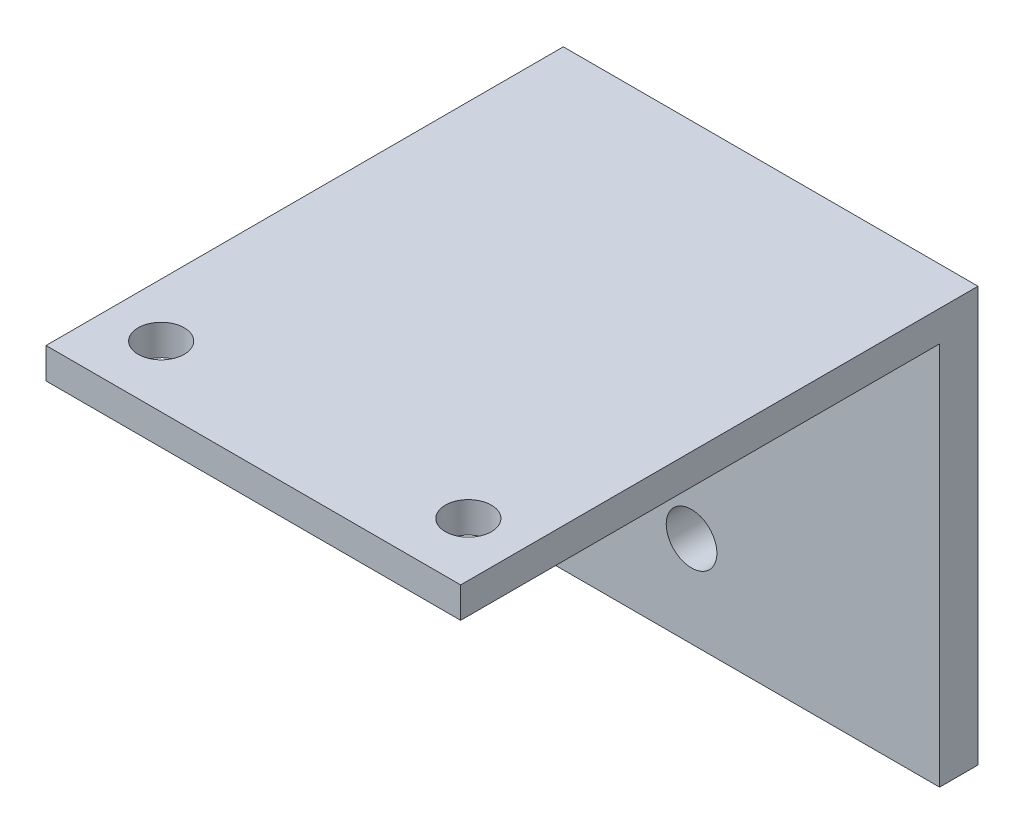
ISO-10303-21;
HEADER;
FILE_DESCRIPTION(('STEP AP214'),'2;1');
FILE_NAME('part.step','',(''),(''),'','','');
FILE_SCHEMA(('AUTOMOTIVE_DESIGN { 1 0 10303 214 1 1 1 1 }'));
ENDSEC;
DATA;
#1=APPLICATION_CONTEXT('core data for automotive mechanical design processes');
#2=APPLICATION_PROTOCOL_DEFINITION('international standard','automotive_design',2000,#1);
#3=PRODUCT_CONTEXT('',#1,'mechanical');
#4=PRODUCT('Part','Part','',(#3));
#5=PRODUCT_RELATED_PRODUCT_CATEGORY('part','',(#4));
#6=PRODUCT_DEFINITION_FORMATION('','',#4);
#7=PRODUCT_DEFINITION_CONTEXT('part definition',#1,'design');
#8=PRODUCT_DEFINITION('design','',#6,#7);
#9=PRODUCT_DEFINITION_SHAPE('','',#8);
#10=(LENGTH_UNIT() NAMED_UNIT(*) SI_UNIT(.MILLI.,.METRE.));
#11=(NAMED_UNIT(*) PLANE_ANGLE_UNIT() SI_UNIT($,.RADIAN.));
#12=(NAMED_UNIT(*) SI_UNIT($,.STERADIAN.) SOLID_ANGLE_UNIT());
#13=UNCERTAINTY_MEASURE_WITH_UNIT(LENGTH_MEASURE(1.E-05),#10,'distance_accuracy_value','');
#14=(GEOMETRIC_REPRESENTATION_CONTEXT(3) GLOBAL_UNCERTAINTY_ASSIGNED_CONTEXT((#13)) GLOBAL_UNIT_ASSIGNED_CONTEXT((#10,
#11,#12)) REPRESENTATION_CONTEXT('',''));
#15=CARTESIAN_POINT('',(0.,0.,0.));
#16=DIRECTION('',(0.,0.,1.));
#17=DIRECTION('',(1.,0.,0.));
#18=AXIS2_PLACEMENT_3D('',#15,#16,#17);
#19=CARTESIAN_POINT('',(0.,-27.,67.37));
#20=DIRECTION('',(0.,1.,0.));
#21=DIRECTION('',(0.,0.,1.));
#22=AXIS2_PLACEMENT_3D('',#19,#20,#21);
#23=PLANE('',#22);
#24=DIRECTION('',(1.,0.,0.));
#25=VECTOR('',#24,1.);
#26=CARTESIAN_POINT('',(0.,-27.,5.));
#27=LINE('',#26,#25);
#28=CARTESIAN_POINT('',(-27.,-27.,5.));
#29=VERTEX_POINT('',#28);
#30=CARTESIAN_POINT('',(27.,-27.,5.));
#31=VERTEX_POINT('',#30);
#32=EDGE_CURVE('E136',#29,#31,#27,.T.);
#33=ORIENTED_EDGE('',*,*,#32,.F.);
#34=DIRECTION('',(0.,0.,-1.));
#35=VECTOR('',#34,1.);
#36=CARTESIAN_POINT('',(-27.,-27.,67.37));
#37=LINE('',#36,#35);
#38=CARTESIAN_POINT('',(-27.,-27.,0.));
#39=VERTEX_POINT('',#38);
#40=EDGE_CURVE('E143',#29,#39,#37,.T.);
#41=ORIENTED_EDGE('',*,*,#40,.T.);
#42=DIRECTION('',(1.,0.,0.));
#43=VECTOR('',#42,1.);
#44=CARTESIAN_POINT('',(0.,-27.,0.));
#45=LINE('',#44,#43);
#46=CARTESIAN_POINT('',(27.,-27.,0.));
#47=VERTEX_POINT('',#46);
#48=EDGE_CURVE('E127',#39,#47,#45,.T.);
#49=ORIENTED_EDGE('',*,*,#48,.T.);
#50=DIRECTION('',(0.,0.,-1.));
#51=VECTOR('',#50,1.);
#52=CARTESIAN_POINT('',(27.,-27.,67.37));
#53=LINE('',#52,#51);
#54=EDGE_CURVE('E117',#31,#47,#53,.T.);
#55=ORIENTED_EDGE('',*,*,#54,.F.);
#56=EDGE_LOOP('',(#33,#41,#49,#55));
#57=FACE_BOUND('',#56,.T.);
#58=ADVANCED_FACE('F64',(#57),#23,.F.);
#59=CARTESIAN_POINT('',(-27.,0.,67.37));
#60=DIRECTION('',(-1.,0.,0.));
#61=DIRECTION('',(0.,0.,1.));
#62=AXIS2_PLACEMENT_3D('',#59,#60,#61);
#63=PLANE('',#62);
#64=DIRECTION('',(0.,0.,-1.));
#65=VECTOR('',#64,1.);
#66=CARTESIAN_POINT('',(-27.,23.,67.37));
#67=LINE('',#66,#65);
#68=CARTESIAN_POINT('',(-27.,23.,67.37));
#69=VERTEX_POINT('',#68);
#70=CARTESIAN_POINT('',(-27.,23.,5.));
#71=VERTEX_POINT('',#70);
#72=EDGE_CURVE('E176',#69,#71,#67,.T.);
#73=ORIENTED_EDGE('',*,*,#72,.F.);
#74=DIRECTION('',(0.,1.,0.));
#75=VECTOR('',#74,1.);
#76=CARTESIAN_POINT('',(-27.,0.,67.37));
#77=LINE('',#76,#75);
#78=CARTESIAN_POINT('',(-27.,27.,67.37));
#79=VERTEX_POINT('',#78);
#80=EDGE_CURVE('E181',#69,#79,#77,.T.);
#81=ORIENTED_EDGE('',*,*,#80,.T.);
#82=DIRECTION('',(0.,0.,-1.));
#83=VECTOR('',#82,1.);
#84=CARTESIAN_POINT('',(-27.,27.,67.37));
#85=LINE('',#84,#83);
#86=CARTESIAN_POINT('',(-27.,27.,0.));
#87=VERTEX_POINT('',#86);
#88=EDGE_CURVE('E145',#79,#87,#85,.T.);
#89=ORIENTED_EDGE('',*,*,#88,.T.);
#90=DIRECTION('',(0.,1.,0.));
#91=VECTOR('',#90,1.);
#92=CARTESIAN_POINT('',(-27.,0.,0.));
#93=LINE('',#92,#91);
#94=EDGE_CURVE('E131',#39,#87,#93,.T.);
#95=ORIENTED_EDGE('',*,*,#94,.F.);
#96=ORIENTED_EDGE('',*,*,#40,.F.);
#97=DIRECTION('',(0.,1.,0.));
#98=VECTOR('',#97,1.);
#99=CARTESIAN_POINT('',(-27.,0.,5.));
#100=LINE('',#99,#98);
#101=EDGE_CURVE('E132',#29,#71,#100,.T.);
#102=ORIENTED_EDGE('',*,*,#101,.T.);
#103=EDGE_LOOP('',(#73,#81,#89,#95,#96,#102));
#104=FACE_BOUND('',#103,.T.);
#105=ADVANCED_FACE('F185',(#104),#63,.T.);
#106=CARTESIAN_POINT('',(27.,0.,67.37));
#107=DIRECTION('',(-1.,0.,0.));
#108=DIRECTION('',(0.,0.,1.));
#109=AXIS2_PLACEMENT_3D('',#106,#107,#108);
#110=PLANE('',#109);
#111=DIRECTION('',(0.,1.,0.));
#112=VECTOR('',#111,1.);
#113=CARTESIAN_POINT('',(27.,0.,67.37));
#114=LINE('',#113,#112);
#115=CARTESIAN_POINT('',(27.,23.,67.37));
#116=VERTEX_POINT('',#115);
#117=CARTESIAN_POINT('',(27.,27.,67.37));
#118=VERTEX_POINT('',#117);
#119=EDGE_CURVE('E89',#116,#118,#114,.T.);
#120=ORIENTED_EDGE('',*,*,#119,.F.);
#121=DIRECTION('',(0.,0.,-1.));
#122=VECTOR('',#121,1.);
#123=CARTESIAN_POINT('',(27.,23.,67.37));
#124=LINE('',#123,#122);
#125=CARTESIAN_POINT('',(27.,23.,5.));
#126=VERTEX_POINT('',#125);
#127=EDGE_CURVE('E81',#116,#126,#124,.T.);
#128=ORIENTED_EDGE('',*,*,#127,.T.);
#129=DIRECTION('',(0.,1.,0.));
#130=VECTOR('',#129,1.);
#131=CARTESIAN_POINT('',(27.,0.,5.));
#132=LINE('',#131,#130);
#133=EDGE_CURVE('E12',#31,#126,#132,.T.);
#134=ORIENTED_EDGE('',*,*,#133,.F.);
#135=ORIENTED_EDGE('',*,*,#54,.T.);
#136=DIRECTION('',(0.,1.,0.));
#137=VECTOR('',#136,1.);
#138=CARTESIAN_POINT('',(27.,0.,0.));
#139=LINE('',#138,#137);
#140=CARTESIAN_POINT('',(27.,27.,0.));
#141=VERTEX_POINT('',#140);
#142=EDGE_CURVE('E120',#47,#141,#139,.T.);
#143=ORIENTED_EDGE('',*,*,#142,.T.);
#144=DIRECTION('',(0.,0.,-1.));
#145=VECTOR('',#144,1.);
#146=CARTESIAN_POINT('',(27.,27.,67.37));
#147=LINE('',#146,#145);
#148=EDGE_CURVE('E109',#118,#141,#147,.T.);
#149=ORIENTED_EDGE('',*,*,#148,.F.);
#150=EDGE_LOOP('',(#120,#128,#134,#135,#143,#149));
#151=FACE_BOUND('',#150,.T.);
#152=ADVANCED_FACE('F121',(#151),#110,.F.);
#153=CARTESIAN_POINT('',(0.,27.,67.37));
#154=DIRECTION('',(0.,1.,0.));
#155=DIRECTION('',(0.,0.,1.));
#156=AXIS2_PLACEMENT_3D('',#153,#154,#155);
#157=PLANE('',#156);
#158=CARTESIAN_POINT('',(20.,27.,59.37));
#159=DIRECTION('',(0.,1.,0.));
#160=DIRECTION('',(0.,0.,1.));
#161=AXIS2_PLACEMENT_3D('',#158,#159,#160);
#162=CIRCLE('',#161,3.);
#163=CARTESIAN_POINT('',(20.,27.,62.37));
#164=VERTEX_POINT('',#163);
#165=EDGE_CURVE('E154',#164,#164,#162,.T.);
#166=ORIENTED_EDGE('',*,*,#165,.F.);
#167=EDGE_LOOP('',(#166));
#168=FACE_BOUND('',#167,.T.);
#169=CARTESIAN_POINT('',(-20.,27.,59.37));
#170=DIRECTION('',(0.,1.,0.));
#171=DIRECTION('',(0.,0.,1.));
#172=AXIS2_PLACEMENT_3D('',#169,#170,#171);
#173=CIRCLE('',#172,3.);
#174=CARTESIAN_POINT('',(-20.,27.,62.37));
#175=VERTEX_POINT('',#174);
#176=EDGE_CURVE('E169',#175,#175,#173,.T.);
#177=ORIENTED_EDGE('',*,*,#176,.F.);
#178=EDGE_LOOP('',(#177));
#179=FACE_BOUND('',#178,.T.);
#180=DIRECTION('',(1.,0.,0.));
#181=VECTOR('',#180,1.);
#182=CARTESIAN_POINT('',(0.,27.,0.));
#183=LINE('',#182,#181);
#184=EDGE_CURVE('E113',#87,#141,#183,.T.);
#185=ORIENTED_EDGE('',*,*,#184,.F.);
#186=ORIENTED_EDGE('',*,*,#88,.F.);
#187=DIRECTION('',(1.,0.,0.));
#188=VECTOR('',#187,1.);
#189=CARTESIAN_POINT('',(0.,27.,67.37));
#190=LINE('',#189,#188);
#191=EDGE_CURVE('E115',#79,#118,#190,.T.);
#192=ORIENTED_EDGE('',*,*,#191,.T.);
#193=ORIENTED_EDGE('',*,*,#148,.T.);
#194=EDGE_LOOP('',(#185,#186,#192,#193));
#195=FACE_BOUND('',#194,.T.);
#196=ADVANCED_FACE('F66',(#168,#179,#195),#157,.T.);
#197=CARTESIAN_POINT('',(0.,0.,0.));
#198=DIRECTION('',(0.,0.,1.));
#199=DIRECTION('',(1.,0.,0.));
#200=AXIS2_PLACEMENT_3D('',#197,#198,#199);
#201=PLANE('',#200);
#202=CARTESIAN_POINT('',(-5.30311489821652,16.5000000008996,0.));
#203=DIRECTION('',(0.,0.,-1.));
#204=DIRECTION('',(-1.,0.,0.));
#205=AXIS2_PLACEMENT_3D('',#202,#203,#204);
#206=CIRCLE('',#205,3.29999999999999);
#207=CARTESIAN_POINT('',(-8.60311489821651,16.5000000008996,0.));
#208=VERTEX_POINT('',#207);
#209=EDGE_CURVE('E161',#208,#208,#206,.T.);
#210=ORIENTED_EDGE('',*,*,#209,.F.);
#211=EDGE_LOOP('',(#210));
#212=FACE_BOUND('',#211,.T.);
#213=CARTESIAN_POINT('',(-5.30311489821652,-15.1244676838189,0.));
#214=DIRECTION('',(0.,0.,-1.));
#215=DIRECTION('',(-1.,0.,0.));
#216=AXIS2_PLACEMENT_3D('',#213,#214,#215);
#217=CIRCLE('',#216,3.29999999999999);
#218=CARTESIAN_POINT('',(-8.60311489821651,-15.1244676838189,0.));
#219=VERTEX_POINT('',#218);
#220=EDGE_CURVE('E150',#219,#219,#217,.T.);
#221=ORIENTED_EDGE('',*,*,#220,.F.);
#222=EDGE_LOOP('',(#221));
#223=FACE_BOUND('',#222,.T.);
#224=ORIENTED_EDGE('',*,*,#184,.T.);
#225=ORIENTED_EDGE('',*,*,#142,.F.);
#226=ORIENTED_EDGE('',*,*,#48,.F.);
#227=ORIENTED_EDGE('',*,*,#94,.T.);
#228=EDGE_LOOP('',(#224,#225,#226,#227));
#229=FACE_BOUND('',#228,.T.);
#230=ADVANCED_FACE('F129',(#212,#223,#229),#201,.F.);
#231=CARTESIAN_POINT('',(0.,0.,67.37));
#232=DIRECTION('',(0.,0.,1.));
#233=DIRECTION('',(1.,0.,0.));
#234=AXIS2_PLACEMENT_3D('',#231,#232,#233);
#235=PLANE('',#234);
#236=DIRECTION('',(-1.,0.,0.));
#237=VECTOR('',#236,1.);
#238=CARTESIAN_POINT('',(0.,23.,67.37));
#239=LINE('',#238,#237);
#240=EDGE_CURVE('E73',#116,#69,#239,.T.);
#241=ORIENTED_EDGE('',*,*,#240,.F.);
#242=ORIENTED_EDGE('',*,*,#119,.T.);
#243=ORIENTED_EDGE('',*,*,#191,.F.);
#244=ORIENTED_EDGE('',*,*,#80,.F.);
#245=EDGE_LOOP('',(#241,#242,#243,#244));
#246=FACE_BOUND('',#245,.T.);
#247=ADVANCED_FACE('F187',(#246),#235,.T.);
#248=CARTESIAN_POINT('',(38.7750425347235,23.,5.));
#249=DIRECTION('',(0.,1.,0.));
#250=DIRECTION('',(0.,0.,1.));
#251=AXIS2_PLACEMENT_3D('',#248,#249,#250);
#252=PLANE('',#251);
#253=CARTESIAN_POINT('',(20.,23.,59.37));
#254=DIRECTION('',(0.,-1.,0.));
#255=DIRECTION('',(0.,0.,-1.));
#256=AXIS2_PLACEMENT_3D('',#253,#254,#255);
#257=CIRCLE('',#256,3.);
#258=CARTESIAN_POINT('',(20.,23.,56.37));
#259=VERTEX_POINT('',#258);
#260=EDGE_CURVE('E149',#259,#259,#257,.T.);
#261=ORIENTED_EDGE('',*,*,#260,.F.);
#262=EDGE_LOOP('',(#261));
#263=FACE_BOUND('',#262,.T.);
#264=CARTESIAN_POINT('',(-20.,23.,59.37));
#265=DIRECTION('',(0.,-1.,0.));
#266=DIRECTION('',(0.,0.,-1.));
#267=AXIS2_PLACEMENT_3D('',#264,#265,#266);
#268=CIRCLE('',#267,3.);
#269=CARTESIAN_POINT('',(-20.,23.,56.37));
#270=VERTEX_POINT('',#269);
#271=EDGE_CURVE('E166',#270,#270,#268,.T.);
#272=ORIENTED_EDGE('',*,*,#271,.F.);
#273=EDGE_LOOP('',(#272));
#274=FACE_BOUND('',#273,.T.);
#275=ORIENTED_EDGE('',*,*,#72,.T.);
#276=DIRECTION('',(-1.,0.,0.));
#277=VECTOR('',#276,1.);
#278=CARTESIAN_POINT('',(38.7750425347235,23.,5.));
#279=LINE('',#278,#277);
#280=EDGE_CURVE('E172',#126,#71,#279,.T.);
#281=ORIENTED_EDGE('',*,*,#280,.F.);
#282=ORIENTED_EDGE('',*,*,#127,.F.);
#283=ORIENTED_EDGE('',*,*,#240,.T.);
#284=EDGE_LOOP('',(#275,#281,#282,#283));
#285=FACE_BOUND('',#284,.T.);
#286=ADVANCED_FACE('F189',(#263,#274,#285),#252,.F.);
#287=CARTESIAN_POINT('',(0.,0.,5.));
#288=DIRECTION('',(0.,0.,1.));
#289=DIRECTION('',(1.,0.,0.));
#290=AXIS2_PLACEMENT_3D('',#287,#288,#289);
#291=PLANE('',#290);
#292=CARTESIAN_POINT('',(-5.30311489821652,16.5000000008996,5.));
#293=DIRECTION('',(0.,0.,1.));
#294=DIRECTION('',(1.,0.,0.));
#295=AXIS2_PLACEMENT_3D('',#292,#293,#294);
#296=CIRCLE('',#295,3.29999999999999);
#297=CARTESIAN_POINT('',(-2.00311489821653,16.5000000008996,5.));
#298=VERTEX_POINT('',#297);
#299=EDGE_CURVE('E68',#298,#298,#296,.T.);
#300=ORIENTED_EDGE('',*,*,#299,.F.);
#301=EDGE_LOOP('',(#300));
#302=FACE_BOUND('',#301,.T.);
#303=CARTESIAN_POINT('',(-5.30311489821652,-15.1244676838189,5.));
#304=DIRECTION('',(0.,0.,1.));
#305=DIRECTION('',(1.,0.,0.));
#306=AXIS2_PLACEMENT_3D('',#303,#304,#305);
#307=CIRCLE('',#306,3.29999999999999);
#308=CARTESIAN_POINT('',(-2.00311489821653,-15.1244676838189,5.));
#309=VERTEX_POINT('',#308);
#310=EDGE_CURVE('E147',#309,#309,#307,.T.);
#311=ORIENTED_EDGE('',*,*,#310,.F.);
#312=EDGE_LOOP('',(#311));
#313=FACE_BOUND('',#312,.T.);
#314=ORIENTED_EDGE('',*,*,#32,.T.);
#315=ORIENTED_EDGE('',*,*,#133,.T.);
#316=ORIENTED_EDGE('',*,*,#280,.T.);
#317=ORIENTED_EDGE('',*,*,#101,.F.);
#318=EDGE_LOOP('',(#314,#315,#316,#317));
#319=FACE_BOUND('',#318,.T.);
#320=ADVANCED_FACE('F195',(#302,#313,#319),#291,.T.);
#321=CARTESIAN_POINT('',(-20.,85.37,59.37));
#322=DIRECTION('',(0.,-1.,0.));
#323=DIRECTION('',(0.,0.,-1.));
#324=AXIS2_PLACEMENT_3D('',#321,#322,#323);
#325=CYLINDRICAL_SURFACE('',#324,3.);
#326=ORIENTED_EDGE('',*,*,#176,.T.);
#327=EDGE_LOOP('',(#326));
#328=FACE_BOUND('',#327,.T.);
#329=ORIENTED_EDGE('',*,*,#271,.T.);
#330=EDGE_LOOP('',(#329));
#331=FACE_BOUND('',#330,.T.);
#332=ADVANCED_FACE('F219',(#328,#331),#325,.F.);
#333=CARTESIAN_POINT('',(20.,85.37,59.37));
#334=DIRECTION('',(0.,-1.,0.));
#335=DIRECTION('',(0.,0.,-1.));
#336=AXIS2_PLACEMENT_3D('',#333,#334,#335);
#337=CYLINDRICAL_SURFACE('',#336,3.);
#338=ORIENTED_EDGE('',*,*,#165,.T.);
#339=EDGE_LOOP('',(#338));
#340=FACE_BOUND('',#339,.T.);
#341=ORIENTED_EDGE('',*,*,#260,.T.);
#342=EDGE_LOOP('',(#341));
#343=FACE_BOUND('',#342,.T.);
#344=ADVANCED_FACE('F222',(#340,#343),#337,.F.);
#345=CARTESIAN_POINT('',(-5.30311489821652,-15.1244676838189,0.));
#346=DIRECTION('',(0.,0.,-1.));
#347=DIRECTION('',(-1.,0.,0.));
#348=AXIS2_PLACEMENT_3D('',#345,#346,#347);
#349=CYLINDRICAL_SURFACE('',#348,3.29999999999999);
#350=ORIENTED_EDGE('',*,*,#310,.T.);
#351=EDGE_LOOP('',(#350));
#352=FACE_BOUND('',#351,.T.);
#353=ORIENTED_EDGE('',*,*,#220,.T.);
#354=EDGE_LOOP('',(#353));
#355=FACE_BOUND('',#354,.T.);
#356=ADVANCED_FACE('F246',(#352,#355),#349,.F.);
#357=CARTESIAN_POINT('',(-5.30311489821652,16.5000000008996,0.));
#358=DIRECTION('',(0.,0.,-1.));
#359=DIRECTION('',(-1.,0.,0.));
#360=AXIS2_PLACEMENT_3D('',#357,#358,#359);
#361=CYLINDRICAL_SURFACE('',#360,3.29999999999999);
#362=ORIENTED_EDGE('',*,*,#299,.T.);
#363=EDGE_LOOP('',(#362));
#364=FACE_BOUND('',#363,.T.);
#365=ORIENTED_EDGE('',*,*,#209,.T.);
#366=EDGE_LOOP('',(#365));
#367=FACE_BOUND('',#366,.T.);
#368=ADVANCED_FACE('F250',(#364,#367),#361,.F.);
#369=CLOSED_SHELL('',(#58,#105,#152,#196,#230,#247,#286,#320,#332,#344,#356,#368));
#370=MANIFOLD_SOLID_BREP('B2',#369);
#371=ADVANCED_BREP_SHAPE_REPRESENTATION('',(#18,#370),#14);
#372=SHAPE_DEFINITION_REPRESENTATION(#9,#371);
ENDSEC;
END-ISO-10303-21;
